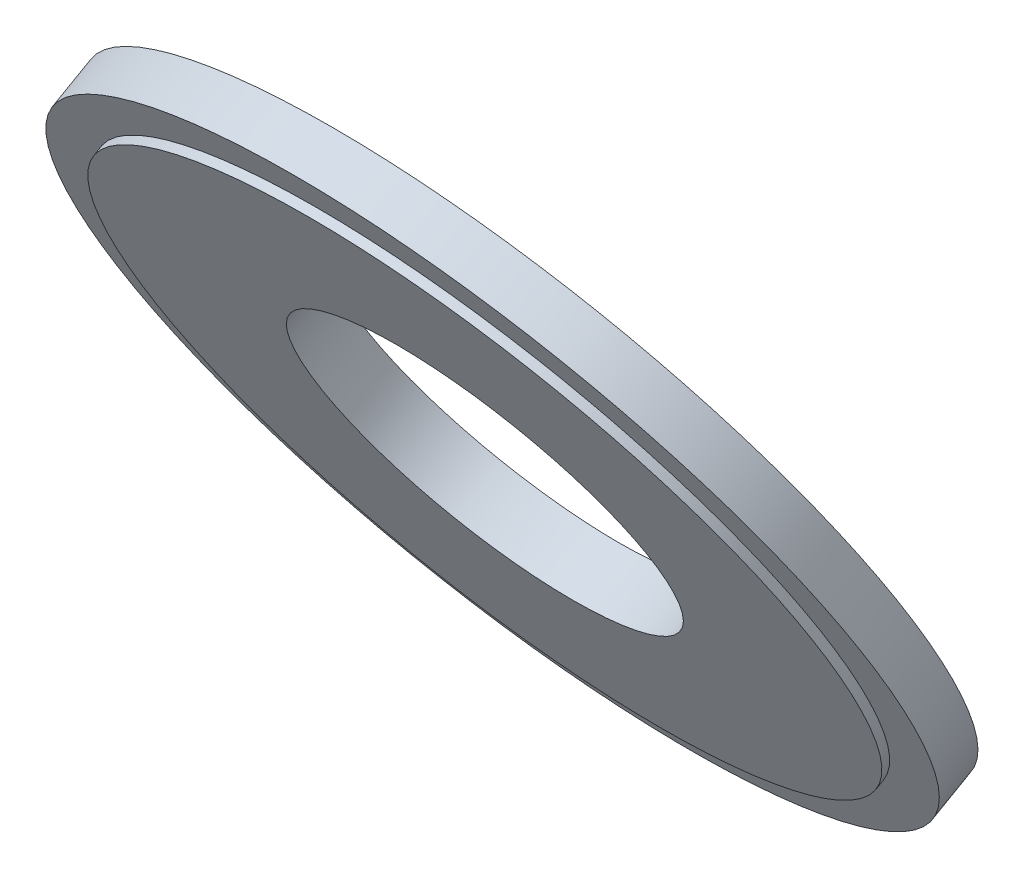
ISO-10303-21;
HEADER;
FILE_DESCRIPTION(('STEP AP214'),'2;1');
FILE_NAME('part.step','',(''),(''),'','','');
FILE_SCHEMA(('AUTOMOTIVE_DESIGN { 1 0 10303 214 1 1 1 1 }'));
ENDSEC;
DATA;
#1=APPLICATION_CONTEXT('core data for automotive mechanical design processes');
#2=APPLICATION_PROTOCOL_DEFINITION('international standard','automotive_design',2000,#1);
#3=PRODUCT_CONTEXT('',#1,'mechanical');
#4=PRODUCT('Part','Part','',(#3));
#5=PRODUCT_RELATED_PRODUCT_CATEGORY('part','',(#4));
#6=PRODUCT_DEFINITION_FORMATION('','',#4);
#7=PRODUCT_DEFINITION_CONTEXT('part definition',#1,'design');
#8=PRODUCT_DEFINITION('design','',#6,#7);
#9=PRODUCT_DEFINITION_SHAPE('','',#8);
#10=(LENGTH_UNIT() NAMED_UNIT(*) SI_UNIT(.MILLI.,.METRE.));
#11=(NAMED_UNIT(*) PLANE_ANGLE_UNIT() SI_UNIT($,.RADIAN.));
#12=(NAMED_UNIT(*) SI_UNIT($,.STERADIAN.) SOLID_ANGLE_UNIT());
#13=UNCERTAINTY_MEASURE_WITH_UNIT(LENGTH_MEASURE(1.E-05),#10,'distance_accuracy_value','');
#14=(GEOMETRIC_REPRESENTATION_CONTEXT(3) GLOBAL_UNCERTAINTY_ASSIGNED_CONTEXT((#13)) GLOBAL_UNIT_ASSIGNED_CONTEXT((#10,
#11,#12)) REPRESENTATION_CONTEXT('',''));
#15=CARTESIAN_POINT('',(0.,0.,0.));
#16=DIRECTION('',(0.,0.,1.));
#17=DIRECTION('',(1.,0.,0.));
#18=AXIS2_PLACEMENT_3D('',#15,#16,#17);
#19=CARTESIAN_POINT('',(0.,47.5035260579652,22.0071252879929));
#20=DIRECTION('',(0.,-0.494736971943452,0.869042765686606));
#21=DIRECTION('',(0.,-0.869042765686606,-0.494736971943452));
#22=AXIS2_PLACEMENT_3D('',#19,#20,#21);
#23=CYLINDRICAL_SURFACE('',#22,7.99999999999999);
#24=CARTESIAN_POINT('',(0.,35.7152219231558,42.7141696550763));
#25=DIRECTION('',(0.,0.494736971943452,-0.869042765686606));
#26=DIRECTION('',(0.,0.869042765686606,0.494736971943452));
#27=AXIS2_PLACEMENT_3D('',#24,#25,#26);
#28=CIRCLE('',#27,7.99999999999999);
#29=CARTESIAN_POINT('',(0.,42.6675640486486,46.6720654306239));
#30=VERTEX_POINT('',#29);
#31=EDGE_CURVE('E50',#30,#30,#28,.T.);
#32=ORIENTED_EDGE('',*,*,#31,.T.);
#33=EDGE_LOOP('',(#32));
#34=FACE_BOUND('',#33,.T.);
#35=CARTESIAN_POINT('',(0.,35.8141693175445,42.540361101939));
#36=DIRECTION('',(0.,0.494736971943452,-0.869042765686606));
#37=DIRECTION('',(0.,0.869042765686606,0.494736971943452));
#38=AXIS2_PLACEMENT_3D('',#35,#36,#37);
#39=CIRCLE('',#38,7.99999999999999);
#40=CARTESIAN_POINT('',(0.,42.7665114430373,46.4982568774866));
#41=VERTEX_POINT('',#40);
#42=EDGE_CURVE('E10',#41,#41,#39,.T.);
#43=ORIENTED_EDGE('',*,*,#42,.F.);
#44=EDGE_LOOP('',(#43));
#45=FACE_BOUND('',#44,.T.);
#46=ADVANCED_FACE('F39',(#34,#45),#23,.T.);
#47=CARTESIAN_POINT('',(0.,35.7152219231558,42.7141696550763));
#48=DIRECTION('',(0.,0.494736971943452,-0.869042765686606));
#49=DIRECTION('',(0.,0.869042765686606,0.494736971943452));
#50=AXIS2_PLACEMENT_3D('',#47,#48,#49);
#51=PLANE('',#50);
#52=ORIENTED_EDGE('',*,*,#31,.F.);
#53=EDGE_LOOP('',(#52));
#54=FACE_BOUND('',#53,.T.);
#55=CARTESIAN_POINT('',(0.,35.7152219231558,42.7141696550763));
#56=DIRECTION('',(0.,0.494736971943452,-0.869042765686606));
#57=DIRECTION('',(0.,0.869042765686606,0.494736971943452));
#58=AXIS2_PLACEMENT_3D('',#55,#56,#57);
#59=CIRCLE('',#58,4.);
#60=CARTESIAN_POINT('',(0.,39.1913929859022,44.6931175428501));
#61=VERTEX_POINT('',#60);
#62=EDGE_CURVE('E54',#61,#61,#59,.T.);
#63=ORIENTED_EDGE('',*,*,#62,.T.);
#64=EDGE_LOOP('',(#63));
#65=FACE_BOUND('',#64,.T.);
#66=ADVANCED_FACE('F78',(#54,#65),#51,.F.);
#67=CARTESIAN_POINT('',(0.,47.5035260579652,22.0071252879929));
#68=DIRECTION('',(0.,-0.494736971943452,0.869042765686606));
#69=DIRECTION('',(0.,-0.869042765686606,-0.494736971943452));
#70=AXIS2_PLACEMENT_3D('',#67,#68,#69);
#71=CYLINDRICAL_SURFACE('',#70,4.);
#72=CARTESIAN_POINT('',(0.,36.3089062894879,41.6713183362524));
#73=DIRECTION('',(0.,-0.494736971943452,0.869042765686606));
#74=DIRECTION('',(0.,-0.869042765686606,-0.494736971943452));
#75=AXIS2_PLACEMENT_3D('',#72,#73,#74);
#76=CIRCLE('',#75,4.);
#77=CARTESIAN_POINT('',(0.,32.8327352267415,39.6923704484786));
#78=VERTEX_POINT('',#77);
#79=EDGE_CURVE('E46',#78,#78,#76,.T.);
#80=ORIENTED_EDGE('',*,*,#79,.F.);
#81=EDGE_LOOP('',(#80));
#82=FACE_BOUND('',#81,.T.);
#83=ORIENTED_EDGE('',*,*,#62,.F.);
#84=EDGE_LOOP('',(#83));
#85=FACE_BOUND('',#84,.T.);
#86=ADVANCED_FACE('F85',(#82,#85),#71,.F.);
#87=CARTESIAN_POINT('',(-30.,23.2732648041888,34.2502637571006));
#88=DIRECTION('',(0.,-0.494736971943452,0.869042765686606));
#89=DIRECTION('',(0.,-0.869042765686606,-0.494736971943452));
#90=AXIS2_PLACEMENT_3D('',#87,#88,#89);
#91=PLANE('',#90);
#92=ORIENTED_EDGE('',*,*,#79,.T.);
#93=EDGE_LOOP('',(#92));
#94=FACE_BOUND('',#93,.T.);
#95=CARTESIAN_POINT('',(0.,36.3089062894879,41.6713183362524));
#96=DIRECTION('',(0.,0.494736971943452,-0.869042765686606));
#97=DIRECTION('',(0.,0.869042765686606,0.494736971943452));
#98=AXIS2_PLACEMENT_3D('',#95,#96,#97);
#99=CIRCLE('',#98,9.00000000000001);
#100=CARTESIAN_POINT('',(0.,44.1302911806674,46.1239510837435));
#101=VERTEX_POINT('',#100);
#102=EDGE_CURVE('E60',#101,#101,#99,.T.);
#103=ORIENTED_EDGE('',*,*,#102,.T.);
#104=EDGE_LOOP('',(#103));
#105=FACE_BOUND('',#104,.T.);
#106=ADVANCED_FACE('F41',(#94,#105),#91,.F.);
#107=CARTESIAN_POINT('',(0.,35.8141693175445,42.540361101939));
#108=DIRECTION('',(0.,0.494736971943452,-0.869042765686606));
#109=DIRECTION('',(0.,0.869042765686606,0.494736971943452));
#110=AXIS2_PLACEMENT_3D('',#107,#108,#109);
#111=CYLINDRICAL_SURFACE('',#110,9.00000000000001);
#112=CARTESIAN_POINT('',(0.,35.8141693175445,42.540361101939));
#113=DIRECTION('',(0.,0.494736971943452,-0.869042765686606));
#114=DIRECTION('',(0.,0.869042765686606,0.494736971943452));
#115=AXIS2_PLACEMENT_3D('',#112,#113,#114);
#116=CIRCLE('',#115,9.00000000000001);
#117=CARTESIAN_POINT('',(0.,43.6355542087239,46.9929938494301));
#118=VERTEX_POINT('',#117);
#119=EDGE_CURVE('E58',#118,#118,#116,.T.);
#120=ORIENTED_EDGE('',*,*,#119,.T.);
#121=EDGE_LOOP('',(#120));
#122=FACE_BOUND('',#121,.T.);
#123=ORIENTED_EDGE('',*,*,#102,.F.);
#124=EDGE_LOOP('',(#123));
#125=FACE_BOUND('',#124,.T.);
#126=ADVANCED_FACE('F66',(#122,#125),#111,.T.);
#127=CARTESIAN_POINT('',(0.,35.8141693175445,42.540361101939));
#128=DIRECTION('',(0.,0.494736971943452,-0.869042765686606));
#129=DIRECTION('',(0.,0.869042765686606,0.494736971943452));
#130=AXIS2_PLACEMENT_3D('',#127,#128,#129);
#131=PLANE('',#130);
#132=ORIENTED_EDGE('',*,*,#42,.T.);
#133=EDGE_LOOP('',(#132));
#134=FACE_BOUND('',#133,.T.);
#135=ORIENTED_EDGE('',*,*,#119,.F.);
#136=EDGE_LOOP('',(#135));
#137=FACE_BOUND('',#136,.T.);
#138=ADVANCED_FACE('F69',(#134,#137),#131,.F.);
#139=CLOSED_SHELL('',(#46,#66,#86,#106,#126,#138));
#140=MANIFOLD_SOLID_BREP('B2',#139);
#141=ADVANCED_BREP_SHAPE_REPRESENTATION('',(#18,#140),#14);
#142=SHAPE_DEFINITION_REPRESENTATION(#9,#141);
ENDSEC;
END-ISO-10303-21;
